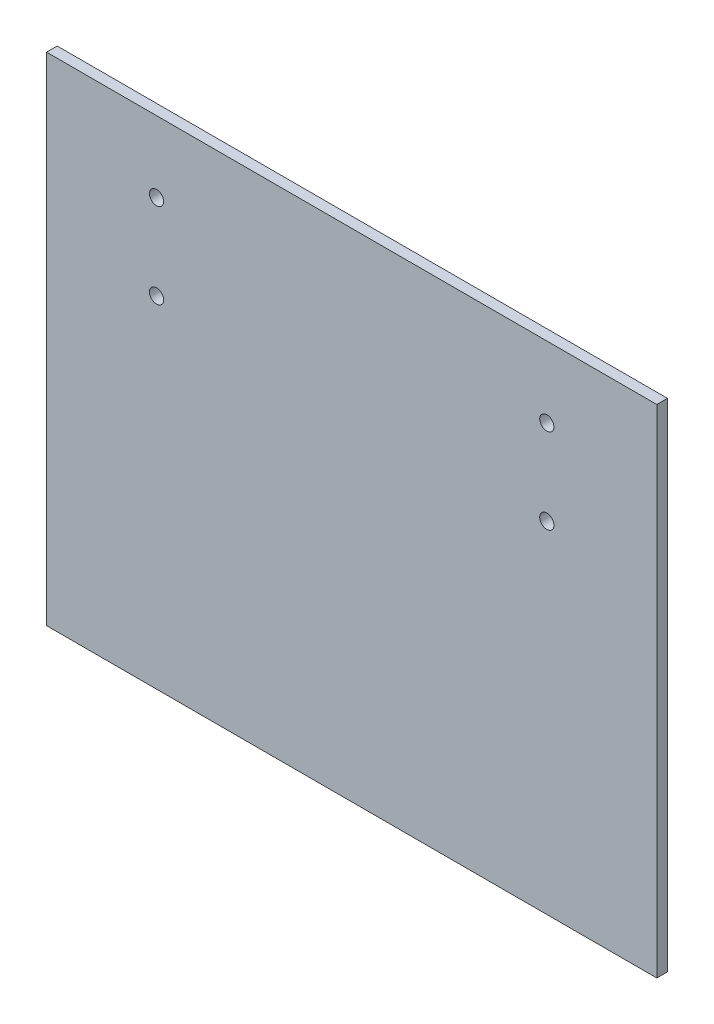
ISO-10303-21;
HEADER;
FILE_DESCRIPTION(('STEP AP214'),'2;1');
FILE_NAME('part.step','',(''),(''),'','','');
FILE_SCHEMA(('AUTOMOTIVE_DESIGN { 1 0 10303 214 1 1 1 1 }'));
ENDSEC;
DATA;
#1=APPLICATION_CONTEXT('core data for automotive mechanical design processes');
#2=APPLICATION_PROTOCOL_DEFINITION('international standard','automotive_design',2000,#1);
#3=PRODUCT_CONTEXT('',#1,'mechanical');
#4=PRODUCT('Part','Part','',(#3));
#5=PRODUCT_RELATED_PRODUCT_CATEGORY('part','',(#4));
#6=PRODUCT_DEFINITION_FORMATION('','',#4);
#7=PRODUCT_DEFINITION_CONTEXT('part definition',#1,'design');
#8=PRODUCT_DEFINITION('design','',#6,#7);
#9=PRODUCT_DEFINITION_SHAPE('','',#8);
#10=(LENGTH_UNIT() NAMED_UNIT(*) SI_UNIT(.MILLI.,.METRE.));
#11=(NAMED_UNIT(*) PLANE_ANGLE_UNIT() SI_UNIT($,.RADIAN.));
#12=(NAMED_UNIT(*) SI_UNIT($,.STERADIAN.) SOLID_ANGLE_UNIT());
#13=UNCERTAINTY_MEASURE_WITH_UNIT(LENGTH_MEASURE(1.E-05),#10,'distance_accuracy_value','');
#14=(GEOMETRIC_REPRESENTATION_CONTEXT(3) GLOBAL_UNCERTAINTY_ASSIGNED_CONTEXT((#13)) GLOBAL_UNIT_ASSIGNED_CONTEXT((#10,
#11,#12)) REPRESENTATION_CONTEXT('',''));
#15=CARTESIAN_POINT('',(0.,0.,0.));
#16=DIRECTION('',(0.,0.,1.));
#17=DIRECTION('',(1.,0.,0.));
#18=AXIS2_PLACEMENT_3D('',#15,#16,#17);
#19=CARTESIAN_POINT('',(0.,0.,3.));
#20=DIRECTION('',(1.,0.,0.));
#21=DIRECTION('',(0.,1.,0.));
#22=AXIS2_PLACEMENT_3D('',#19,#20,#21);
#23=PLANE('',#22);
#24=DIRECTION('',(0.,-1.,0.));
#25=VECTOR('',#24,1.);
#26=CARTESIAN_POINT('',(0.,0.,0.));
#27=LINE('',#26,#25);
#28=CARTESIAN_POINT('',(0.,0.,0.));
#29=VERTEX_POINT('',#28);
#30=CARTESIAN_POINT('',(0.,-140.,0.));
#31=VERTEX_POINT('',#30);
#32=EDGE_CURVE('E107',#29,#31,#27,.T.);
#33=ORIENTED_EDGE('',*,*,#32,.T.);
#34=DIRECTION('',(0.,0.,-1.));
#35=VECTOR('',#34,1.);
#36=CARTESIAN_POINT('',(0.,-140.,3.));
#37=LINE('',#36,#35);
#38=CARTESIAN_POINT('',(0.,-140.,3.));
#39=VERTEX_POINT('',#38);
#40=EDGE_CURVE('E11',#39,#31,#37,.T.);
#41=ORIENTED_EDGE('',*,*,#40,.F.);
#42=DIRECTION('',(0.,-1.,0.));
#43=VECTOR('',#42,1.);
#44=CARTESIAN_POINT('',(0.,0.,3.));
#45=LINE('',#44,#43);
#46=CARTESIAN_POINT('',(0.,0.,3.));
#47=VERTEX_POINT('',#46);
#48=EDGE_CURVE('E94',#47,#39,#45,.T.);
#49=ORIENTED_EDGE('',*,*,#48,.F.);
#50=DIRECTION('',(0.,0.,-1.));
#51=VECTOR('',#50,1.);
#52=CARTESIAN_POINT('',(0.,0.,3.));
#53=LINE('',#52,#51);
#54=EDGE_CURVE('E103',#47,#29,#53,.T.);
#55=ORIENTED_EDGE('',*,*,#54,.T.);
#56=EDGE_LOOP('',(#33,#41,#49,#55));
#57=FACE_BOUND('',#56,.T.);
#58=ADVANCED_FACE('F41',(#57),#23,.F.);
#59=CARTESIAN_POINT('',(0.,-140.,3.));
#60=DIRECTION('',(0.,1.,0.));
#61=DIRECTION('',(0.,0.,1.));
#62=AXIS2_PLACEMENT_3D('',#59,#60,#61);
#63=PLANE('',#62);
#64=DIRECTION('',(1.,0.,0.));
#65=VECTOR('',#64,1.);
#66=CARTESIAN_POINT('',(0.,-140.,0.));
#67=LINE('',#66,#65);
#68=CARTESIAN_POINT('',(172.,-140.,0.));
#69=VERTEX_POINT('',#68);
#70=EDGE_CURVE('E98',#31,#69,#67,.T.);
#71=ORIENTED_EDGE('',*,*,#70,.T.);
#72=DIRECTION('',(0.,0.,-1.));
#73=VECTOR('',#72,1.);
#74=CARTESIAN_POINT('',(172.,-140.,3.));
#75=LINE('',#74,#73);
#76=CARTESIAN_POINT('',(172.,-140.,3.));
#77=VERTEX_POINT('',#76);
#78=EDGE_CURVE('E50',#77,#69,#75,.T.);
#79=ORIENTED_EDGE('',*,*,#78,.F.);
#80=DIRECTION('',(1.,0.,0.));
#81=VECTOR('',#80,1.);
#82=CARTESIAN_POINT('',(0.,-140.,3.));
#83=LINE('',#82,#81);
#84=EDGE_CURVE('E89',#39,#77,#83,.T.);
#85=ORIENTED_EDGE('',*,*,#84,.F.);
#86=ORIENTED_EDGE('',*,*,#40,.T.);
#87=EDGE_LOOP('',(#71,#79,#85,#86));
#88=FACE_BOUND('',#87,.T.);
#89=ADVANCED_FACE('F97',(#88),#63,.F.);
#90=CARTESIAN_POINT('',(172.,0.,3.));
#91=DIRECTION('',(-1.,0.,0.));
#92=DIRECTION('',(0.,-1.,0.));
#93=AXIS2_PLACEMENT_3D('',#90,#91,#92);
#94=PLANE('',#93);
#95=DIRECTION('',(0.,1.,0.));
#96=VECTOR('',#95,1.);
#97=CARTESIAN_POINT('',(172.,0.,0.));
#98=LINE('',#97,#96);
#99=CARTESIAN_POINT('',(172.,0.,0.));
#100=VERTEX_POINT('',#99);
#101=EDGE_CURVE('E76',#69,#100,#98,.T.);
#102=ORIENTED_EDGE('',*,*,#101,.T.);
#103=DIRECTION('',(0.,0.,-1.));
#104=VECTOR('',#103,1.);
#105=CARTESIAN_POINT('',(172.,0.,3.));
#106=LINE('',#105,#104);
#107=CARTESIAN_POINT('',(172.,0.,3.));
#108=VERTEX_POINT('',#107);
#109=EDGE_CURVE('E99',#108,#100,#106,.T.);
#110=ORIENTED_EDGE('',*,*,#109,.F.);
#111=DIRECTION('',(0.,1.,0.));
#112=VECTOR('',#111,1.);
#113=CARTESIAN_POINT('',(172.,0.,3.));
#114=LINE('',#113,#112);
#115=EDGE_CURVE('E92',#77,#108,#114,.T.);
#116=ORIENTED_EDGE('',*,*,#115,.F.);
#117=ORIENTED_EDGE('',*,*,#78,.T.);
#118=EDGE_LOOP('',(#102,#110,#116,#117));
#119=FACE_BOUND('',#118,.T.);
#120=ADVANCED_FACE('F101',(#119),#94,.F.);
#121=CARTESIAN_POINT('',(0.,0.,3.));
#122=DIRECTION('',(0.,-1.,0.));
#123=DIRECTION('',(0.,0.,-1.));
#124=AXIS2_PLACEMENT_3D('',#121,#122,#123);
#125=PLANE('',#124);
#126=DIRECTION('',(-1.,0.,0.));
#127=VECTOR('',#126,1.);
#128=CARTESIAN_POINT('',(0.,0.,0.));
#129=LINE('',#128,#127);
#130=EDGE_CURVE('E82',#100,#29,#129,.T.);
#131=ORIENTED_EDGE('',*,*,#130,.T.);
#132=ORIENTED_EDGE('',*,*,#54,.F.);
#133=DIRECTION('',(-1.,0.,0.));
#134=VECTOR('',#133,1.);
#135=CARTESIAN_POINT('',(0.,0.,3.));
#136=LINE('',#135,#134);
#137=EDGE_CURVE('E59',#108,#47,#136,.T.);
#138=ORIENTED_EDGE('',*,*,#137,.F.);
#139=ORIENTED_EDGE('',*,*,#109,.T.);
#140=EDGE_LOOP('',(#131,#132,#138,#139));
#141=FACE_BOUND('',#140,.T.);
#142=ADVANCED_FACE('F158',(#141),#125,.F.);
#143=CARTESIAN_POINT('',(0.,0.,3.));
#144=DIRECTION('',(0.,0.,1.));
#145=DIRECTION('',(1.,0.,0.));
#146=AXIS2_PLACEMENT_3D('',#143,#144,#145);
#147=PLANE('',#146);
#148=CARTESIAN_POINT('',(141.,-20.,3.));
#149=DIRECTION('',(0.,0.,1.));
#150=DIRECTION('',(-1.,0.,0.));
#151=AXIS2_PLACEMENT_3D('',#148,#149,#150);
#152=CIRCLE('',#151,2.);
#153=CARTESIAN_POINT('',(139.,-20.,3.));
#154=VERTEX_POINT('',#153);
#155=EDGE_CURVE('E227',#154,#154,#152,.T.);
#156=ORIENTED_EDGE('',*,*,#155,.F.);
#157=EDGE_LOOP('',(#156));
#158=FACE_BOUND('',#157,.T.);
#159=CARTESIAN_POINT('',(141.,-44.,3.));
#160=DIRECTION('',(0.,0.,1.));
#161=DIRECTION('',(-1.,0.,0.));
#162=AXIS2_PLACEMENT_3D('',#159,#160,#161);
#163=CIRCLE('',#162,2.00000000000003);
#164=CARTESIAN_POINT('',(139.,-44.,3.));
#165=VERTEX_POINT('',#164);
#166=EDGE_CURVE('E222',#165,#165,#163,.T.);
#167=ORIENTED_EDGE('',*,*,#166,.F.);
#168=EDGE_LOOP('',(#167));
#169=FACE_BOUND('',#168,.T.);
#170=CARTESIAN_POINT('',(31.0000000000002,-44.,3.));
#171=DIRECTION('',(0.,0.,1.));
#172=DIRECTION('',(1.,0.,0.));
#173=AXIS2_PLACEMENT_3D('',#170,#171,#172);
#174=CIRCLE('',#173,2.00000000000001);
#175=CARTESIAN_POINT('',(33.0000000000003,-44.,3.));
#176=VERTEX_POINT('',#175);
#177=EDGE_CURVE('E215',#176,#176,#174,.T.);
#178=ORIENTED_EDGE('',*,*,#177,.F.);
#179=EDGE_LOOP('',(#178));
#180=FACE_BOUND('',#179,.T.);
#181=CARTESIAN_POINT('',(31.,-20.,3.));
#182=DIRECTION('',(0.,0.,1.));
#183=DIRECTION('',(1.,0.,0.));
#184=AXIS2_PLACEMENT_3D('',#181,#182,#183);
#185=CIRCLE('',#184,2.);
#186=CARTESIAN_POINT('',(33.,-20.,3.));
#187=VERTEX_POINT('',#186);
#188=EDGE_CURVE('E119',#187,#187,#185,.T.);
#189=ORIENTED_EDGE('',*,*,#188,.F.);
#190=EDGE_LOOP('',(#189));
#191=FACE_BOUND('',#190,.T.);
#192=ORIENTED_EDGE('',*,*,#48,.T.);
#193=ORIENTED_EDGE('',*,*,#84,.T.);
#194=ORIENTED_EDGE('',*,*,#115,.T.);
#195=ORIENTED_EDGE('',*,*,#137,.T.);
#196=EDGE_LOOP('',(#192,#193,#194,#195));
#197=FACE_BOUND('',#196,.T.);
#198=ADVANCED_FACE('F90',(#158,#169,#180,#191,#197),#147,.T.);
#199=CARTESIAN_POINT('',(0.,0.,0.));
#200=DIRECTION('',(0.,0.,1.));
#201=DIRECTION('',(1.,0.,0.));
#202=AXIS2_PLACEMENT_3D('',#199,#200,#201);
#203=PLANE('',#202);
#204=CARTESIAN_POINT('',(141.,-20.,0.));
#205=DIRECTION('',(0.,0.,1.));
#206=DIRECTION('',(1.,0.,0.));
#207=AXIS2_PLACEMENT_3D('',#204,#205,#206);
#208=CIRCLE('',#207,2.);
#209=CARTESIAN_POINT('',(143.,-20.,0.));
#210=VERTEX_POINT('',#209);
#211=EDGE_CURVE('E44',#210,#210,#208,.T.);
#212=ORIENTED_EDGE('',*,*,#211,.T.);
#213=EDGE_LOOP('',(#212));
#214=FACE_BOUND('',#213,.T.);
#215=CARTESIAN_POINT('',(141.,-44.,0.));
#216=DIRECTION('',(0.,0.,1.));
#217=DIRECTION('',(1.,0.,0.));
#218=AXIS2_PLACEMENT_3D('',#215,#216,#217);
#219=CIRCLE('',#218,2.00000000000003);
#220=CARTESIAN_POINT('',(143.,-44.,0.));
#221=VERTEX_POINT('',#220);
#222=EDGE_CURVE('E121',#221,#221,#219,.T.);
#223=ORIENTED_EDGE('',*,*,#222,.T.);
#224=EDGE_LOOP('',(#223));
#225=FACE_BOUND('',#224,.T.);
#226=CARTESIAN_POINT('',(31.0000000000002,-44.,0.));
#227=DIRECTION('',(0.,0.,1.));
#228=DIRECTION('',(1.,0.,0.));
#229=AXIS2_PLACEMENT_3D('',#226,#227,#228);
#230=CIRCLE('',#229,2.00000000000001);
#231=CARTESIAN_POINT('',(33.0000000000003,-44.,0.));
#232=VERTEX_POINT('',#231);
#233=EDGE_CURVE('E118',#232,#232,#230,.T.);
#234=ORIENTED_EDGE('',*,*,#233,.T.);
#235=EDGE_LOOP('',(#234));
#236=FACE_BOUND('',#235,.T.);
#237=CARTESIAN_POINT('',(31.,-20.,0.));
#238=DIRECTION('',(0.,0.,1.));
#239=DIRECTION('',(1.,0.,0.));
#240=AXIS2_PLACEMENT_3D('',#237,#238,#239);
#241=CIRCLE('',#240,2.);
#242=CARTESIAN_POINT('',(33.,-20.,0.));
#243=VERTEX_POINT('',#242);
#244=EDGE_CURVE('E115',#243,#243,#241,.T.);
#245=ORIENTED_EDGE('',*,*,#244,.T.);
#246=EDGE_LOOP('',(#245));
#247=FACE_BOUND('',#246,.T.);
#248=ORIENTED_EDGE('',*,*,#32,.F.);
#249=ORIENTED_EDGE('',*,*,#130,.F.);
#250=ORIENTED_EDGE('',*,*,#101,.F.);
#251=ORIENTED_EDGE('',*,*,#70,.F.);
#252=EDGE_LOOP('',(#248,#249,#250,#251));
#253=FACE_BOUND('',#252,.T.);
#254=ADVANCED_FACE('F128',(#214,#225,#236,#247,#253),#203,.F.);
#255=CARTESIAN_POINT('',(31.,-20.,-34.));
#256=DIRECTION('',(0.,0.,1.));
#257=DIRECTION('',(1.,0.,0.));
#258=AXIS2_PLACEMENT_3D('',#255,#256,#257);
#259=CYLINDRICAL_SURFACE('',#258,2.);
#260=ORIENTED_EDGE('',*,*,#188,.T.);
#261=EDGE_LOOP('',(#260));
#262=FACE_BOUND('',#261,.T.);
#263=ORIENTED_EDGE('',*,*,#244,.F.);
#264=EDGE_LOOP('',(#263));
#265=FACE_BOUND('',#264,.T.);
#266=ADVANCED_FACE('F151',(#262,#265),#259,.F.);
#267=CARTESIAN_POINT('',(31.0000000000002,-44.,-34.));
#268=DIRECTION('',(0.,0.,1.));
#269=DIRECTION('',(1.,0.,0.));
#270=AXIS2_PLACEMENT_3D('',#267,#268,#269);
#271=CYLINDRICAL_SURFACE('',#270,2.00000000000001);
#272=ORIENTED_EDGE('',*,*,#177,.T.);
#273=EDGE_LOOP('',(#272));
#274=FACE_BOUND('',#273,.T.);
#275=ORIENTED_EDGE('',*,*,#233,.F.);
#276=EDGE_LOOP('',(#275));
#277=FACE_BOUND('',#276,.T.);
#278=ADVANCED_FACE('F138',(#274,#277),#271,.F.);
#279=CARTESIAN_POINT('',(141.,-44.,-34.));
#280=DIRECTION('',(0.,0.,1.));
#281=DIRECTION('',(1.,0.,0.));
#282=AXIS2_PLACEMENT_3D('',#279,#280,#281);
#283=CYLINDRICAL_SURFACE('',#282,2.00000000000003);
#284=ORIENTED_EDGE('',*,*,#166,.T.);
#285=EDGE_LOOP('',(#284));
#286=FACE_BOUND('',#285,.T.);
#287=ORIENTED_EDGE('',*,*,#222,.F.);
#288=EDGE_LOOP('',(#287));
#289=FACE_BOUND('',#288,.T.);
#290=ADVANCED_FACE('F132',(#286,#289),#283,.F.);
#291=CARTESIAN_POINT('',(141.,-20.,-34.));
#292=DIRECTION('',(0.,0.,1.));
#293=DIRECTION('',(1.,0.,0.));
#294=AXIS2_PLACEMENT_3D('',#291,#292,#293);
#295=CYLINDRICAL_SURFACE('',#294,2.);
#296=ORIENTED_EDGE('',*,*,#155,.T.);
#297=EDGE_LOOP('',(#296));
#298=FACE_BOUND('',#297,.T.);
#299=ORIENTED_EDGE('',*,*,#211,.F.);
#300=EDGE_LOOP('',(#299));
#301=FACE_BOUND('',#300,.T.);
#302=ADVANCED_FACE('F130',(#298,#301),#295,.F.);
#303=CLOSED_SHELL('',(#58,#89,#120,#142,#198,#254,#266,#278,#290,#302));
#304=MANIFOLD_SOLID_BREP('B2',#303);
#305=ADVANCED_BREP_SHAPE_REPRESENTATION('',(#18,#304),#14);
#306=SHAPE_DEFINITION_REPRESENTATION(#9,#305);
ENDSEC;
END-ISO-10303-21;
